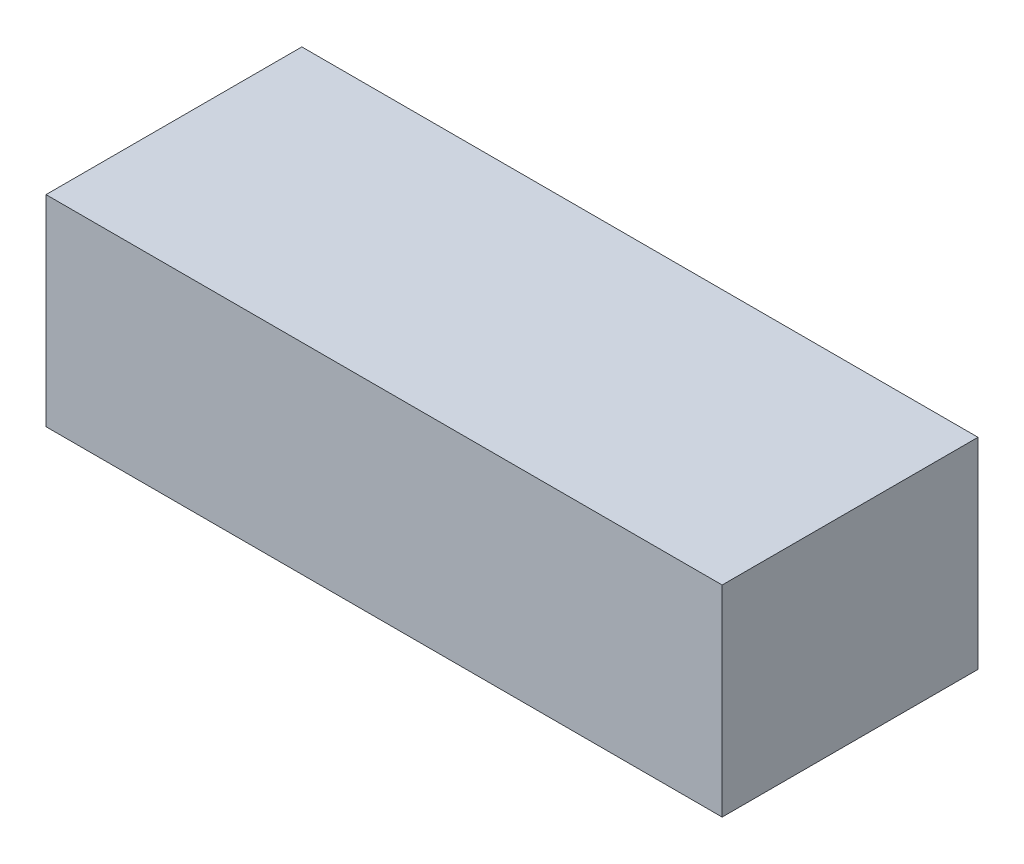
ISO-10303-21;
HEADER;
FILE_DESCRIPTION(('STEP AP214'),'2;1');
FILE_NAME('part.step','',(''),(''),'','','');
FILE_SCHEMA(('AUTOMOTIVE_DESIGN { 1 0 10303 214 1 1 1 1 }'));
ENDSEC;
DATA;
#1=APPLICATION_CONTEXT('core data for automotive mechanical design processes');
#2=APPLICATION_PROTOCOL_DEFINITION('international standard','automotive_design',2000,#1);
#3=PRODUCT_CONTEXT('',#1,'mechanical');
#4=PRODUCT('Part','Part','',(#3));
#5=PRODUCT_RELATED_PRODUCT_CATEGORY('part','',(#4));
#6=PRODUCT_DEFINITION_FORMATION('','',#4);
#7=PRODUCT_DEFINITION_CONTEXT('part definition',#1,'design');
#8=PRODUCT_DEFINITION('design','',#6,#7);
#9=PRODUCT_DEFINITION_SHAPE('','',#8);
#10=(LENGTH_UNIT() NAMED_UNIT(*) SI_UNIT(.MILLI.,.METRE.));
#11=(NAMED_UNIT(*) PLANE_ANGLE_UNIT() SI_UNIT($,.RADIAN.));
#12=(NAMED_UNIT(*) SI_UNIT($,.STERADIAN.) SOLID_ANGLE_UNIT());
#13=UNCERTAINTY_MEASURE_WITH_UNIT(LENGTH_MEASURE(1.E-05),#10,'distance_accuracy_value','');
#14=(GEOMETRIC_REPRESENTATION_CONTEXT(3) GLOBAL_UNCERTAINTY_ASSIGNED_CONTEXT((#13)) GLOBAL_UNIT_ASSIGNED_CONTEXT((#10,
#11,#12)) REPRESENTATION_CONTEXT('',''));
#15=CARTESIAN_POINT('',(0.,0.,0.));
#16=DIRECTION('',(0.,0.,1.));
#17=DIRECTION('',(1.,0.,0.));
#18=AXIS2_PLACEMENT_3D('',#15,#16,#17);
#19=CARTESIAN_POINT('',(-18.7846153846154,11.,-7.4));
#20=DIRECTION('',(1.,0.,0.));
#21=DIRECTION('',(0.,0.,-1.));
#22=AXIS2_PLACEMENT_3D('',#19,#20,#21);
#23=PLANE('',#22);
#24=DIRECTION('',(0.,0.,1.));
#25=VECTOR('',#24,1.);
#26=CARTESIAN_POINT('',(-18.7846153846154,0.,-7.4));
#27=LINE('',#26,#25);
#28=CARTESIAN_POINT('',(-18.7846153846154,0.,-7.4));
#29=VERTEX_POINT('',#28);
#30=CARTESIAN_POINT('',(-18.7846153846154,0.,6.6));
#31=VERTEX_POINT('',#30);
#32=EDGE_CURVE('E98',#29,#31,#27,.T.);
#33=ORIENTED_EDGE('',*,*,#32,.T.);
#34=DIRECTION('',(0.,-1.,0.));
#35=VECTOR('',#34,1.);
#36=CARTESIAN_POINT('',(-18.7846153846154,11.,6.6));
#37=LINE('',#36,#35);
#38=CARTESIAN_POINT('',(-18.7846153846154,11.,6.6));
#39=VERTEX_POINT('',#38);
#40=EDGE_CURVE('E11',#39,#31,#37,.T.);
#41=ORIENTED_EDGE('',*,*,#40,.F.);
#42=DIRECTION('',(0.,0.,1.));
#43=VECTOR('',#42,1.);
#44=CARTESIAN_POINT('',(-18.7846153846154,11.,-7.4));
#45=LINE('',#44,#43);
#46=CARTESIAN_POINT('',(-18.7846153846154,11.,-7.4));
#47=VERTEX_POINT('',#46);
#48=EDGE_CURVE('E84',#47,#39,#45,.T.);
#49=ORIENTED_EDGE('',*,*,#48,.F.);
#50=DIRECTION('',(0.,-1.,0.));
#51=VECTOR('',#50,1.);
#52=CARTESIAN_POINT('',(-18.7846153846154,11.,-7.4));
#53=LINE('',#52,#51);
#54=EDGE_CURVE('E51',#47,#29,#53,.T.);
#55=ORIENTED_EDGE('',*,*,#54,.T.);
#56=EDGE_LOOP('',(#33,#41,#49,#55));
#57=FACE_BOUND('',#56,.T.);
#58=ADVANCED_FACE('F35',(#57),#23,.F.);
#59=CARTESIAN_POINT('',(-18.7846153846154,11.,6.6));
#60=DIRECTION('',(0.,0.,-1.));
#61=DIRECTION('',(-1.,0.,0.));
#62=AXIS2_PLACEMENT_3D('',#59,#60,#61);
#63=PLANE('',#62);
#64=DIRECTION('',(1.,0.,0.));
#65=VECTOR('',#64,1.);
#66=CARTESIAN_POINT('',(-18.7846153846154,0.,6.6));
#67=LINE('',#66,#65);
#68=CARTESIAN_POINT('',(18.2153846153846,0.,6.6));
#69=VERTEX_POINT('',#68);
#70=EDGE_CURVE('E89',#31,#69,#67,.T.);
#71=ORIENTED_EDGE('',*,*,#70,.T.);
#72=DIRECTION('',(0.,-1.,0.));
#73=VECTOR('',#72,1.);
#74=CARTESIAN_POINT('',(18.2153846153846,11.,6.6));
#75=LINE('',#74,#73);
#76=CARTESIAN_POINT('',(18.2153846153846,11.,6.6));
#77=VERTEX_POINT('',#76);
#78=EDGE_CURVE('E43',#77,#69,#75,.T.);
#79=ORIENTED_EDGE('',*,*,#78,.F.);
#80=DIRECTION('',(1.,0.,0.));
#81=VECTOR('',#80,1.);
#82=CARTESIAN_POINT('',(-18.7846153846154,11.,6.6));
#83=LINE('',#82,#81);
#84=EDGE_CURVE('E76',#39,#77,#83,.T.);
#85=ORIENTED_EDGE('',*,*,#84,.F.);
#86=ORIENTED_EDGE('',*,*,#40,.T.);
#87=EDGE_LOOP('',(#71,#79,#85,#86));
#88=FACE_BOUND('',#87,.T.);
#89=ADVANCED_FACE('F88',(#88),#63,.F.);
#90=CARTESIAN_POINT('',(18.2153846153846,11.,-7.4));
#91=DIRECTION('',(1.,0.,0.));
#92=DIRECTION('',(0.,0.,-1.));
#93=AXIS2_PLACEMENT_3D('',#90,#91,#92);
#94=PLANE('',#93);
#95=DIRECTION('',(0.,0.,1.));
#96=VECTOR('',#95,1.);
#97=CARTESIAN_POINT('',(18.2153846153846,0.,-7.4));
#98=LINE('',#97,#96);
#99=CARTESIAN_POINT('',(18.2153846153846,0.,-7.4));
#100=VERTEX_POINT('',#99);
#101=EDGE_CURVE('E101',#100,#69,#98,.T.);
#102=ORIENTED_EDGE('',*,*,#101,.F.);
#103=DIRECTION('',(0.,-1.,0.));
#104=VECTOR('',#103,1.);
#105=CARTESIAN_POINT('',(18.2153846153846,11.,-7.4));
#106=LINE('',#105,#104);
#107=CARTESIAN_POINT('',(18.2153846153846,11.,-7.4));
#108=VERTEX_POINT('',#107);
#109=EDGE_CURVE('E65',#108,#100,#106,.T.);
#110=ORIENTED_EDGE('',*,*,#109,.F.);
#111=DIRECTION('',(0.,0.,1.));
#112=VECTOR('',#111,1.);
#113=CARTESIAN_POINT('',(18.2153846153846,11.,-7.4));
#114=LINE('',#113,#112);
#115=EDGE_CURVE('E83',#108,#77,#114,.T.);
#116=ORIENTED_EDGE('',*,*,#115,.T.);
#117=ORIENTED_EDGE('',*,*,#78,.T.);
#118=EDGE_LOOP('',(#102,#110,#116,#117));
#119=FACE_BOUND('',#118,.T.);
#120=ADVANCED_FACE('F92',(#119),#94,.T.);
#121=CARTESIAN_POINT('',(-18.7846153846154,11.,-7.4));
#122=DIRECTION('',(0.,0.,-1.));
#123=DIRECTION('',(-1.,0.,0.));
#124=AXIS2_PLACEMENT_3D('',#121,#122,#123);
#125=PLANE('',#124);
#126=DIRECTION('',(1.,0.,0.));
#127=VECTOR('',#126,1.);
#128=CARTESIAN_POINT('',(-18.7846153846154,0.,-7.4));
#129=LINE('',#128,#127);
#130=EDGE_CURVE('E103',#29,#100,#129,.T.);
#131=ORIENTED_EDGE('',*,*,#130,.F.);
#132=ORIENTED_EDGE('',*,*,#54,.F.);
#133=DIRECTION('',(1.,0.,0.));
#134=VECTOR('',#133,1.);
#135=CARTESIAN_POINT('',(-18.7846153846154,11.,-7.4));
#136=LINE('',#135,#134);
#137=EDGE_CURVE('E93',#47,#108,#136,.T.);
#138=ORIENTED_EDGE('',*,*,#137,.T.);
#139=ORIENTED_EDGE('',*,*,#109,.T.);
#140=EDGE_LOOP('',(#131,#132,#138,#139));
#141=FACE_BOUND('',#140,.T.);
#142=ADVANCED_FACE('F109',(#141),#125,.T.);
#143=CARTESIAN_POINT('',(0.,11.,0.));
#144=DIRECTION('',(0.,1.,0.));
#145=DIRECTION('',(0.,0.,1.));
#146=AXIS2_PLACEMENT_3D('',#143,#144,#145);
#147=PLANE('',#146);
#148=ORIENTED_EDGE('',*,*,#48,.T.);
#149=ORIENTED_EDGE('',*,*,#84,.T.);
#150=ORIENTED_EDGE('',*,*,#115,.F.);
#151=ORIENTED_EDGE('',*,*,#137,.F.);
#152=EDGE_LOOP('',(#148,#149,#150,#151));
#153=FACE_BOUND('',#152,.T.);
#154=ADVANCED_FACE('F80',(#153),#147,.T.);
#155=CARTESIAN_POINT('',(0.,0.,0.));
#156=DIRECTION('',(0.,1.,0.));
#157=DIRECTION('',(0.,0.,1.));
#158=AXIS2_PLACEMENT_3D('',#155,#156,#157);
#159=PLANE('',#158);
#160=ORIENTED_EDGE('',*,*,#32,.F.);
#161=ORIENTED_EDGE('',*,*,#130,.T.);
#162=ORIENTED_EDGE('',*,*,#101,.T.);
#163=ORIENTED_EDGE('',*,*,#70,.F.);
#164=EDGE_LOOP('',(#160,#161,#162,#163));
#165=FACE_BOUND('',#164,.T.);
#166=ADVANCED_FACE('F108',(#165),#159,.F.);
#167=CLOSED_SHELL('',(#58,#89,#120,#142,#154,#166));
#168=MANIFOLD_SOLID_BREP('B2',#167);
#169=ADVANCED_BREP_SHAPE_REPRESENTATION('',(#18,#168),#14);
#170=SHAPE_DEFINITION_REPRESENTATION(#9,#169);
ENDSEC;
END-ISO-10303-21;
